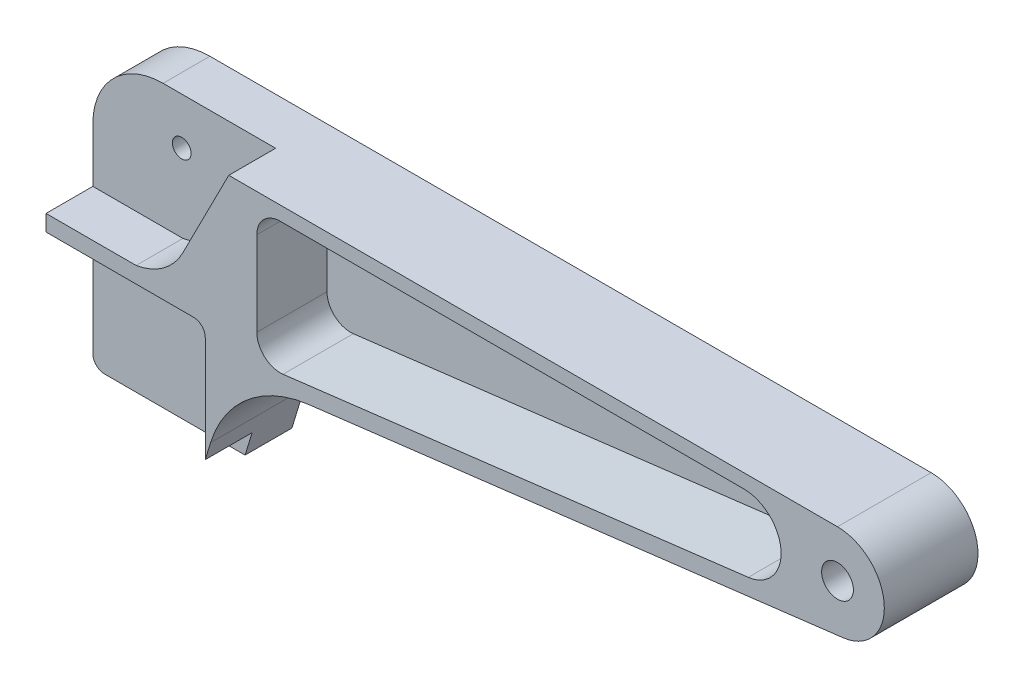
ISO-10303-21;
HEADER;
FILE_DESCRIPTION(('STEP AP214'),'2;1');
FILE_NAME('part.step','',(''),(''),'','','');
FILE_SCHEMA(('AUTOMOTIVE_DESIGN { 1 0 10303 214 1 1 1 1 }'));
ENDSEC;
DATA;
#1=APPLICATION_CONTEXT('core data for automotive mechanical design processes');
#2=APPLICATION_PROTOCOL_DEFINITION('international standard','automotive_design',2000,#1);
#3=PRODUCT_CONTEXT('',#1,'mechanical');
#4=PRODUCT('Part','Part','',(#3));
#5=PRODUCT_RELATED_PRODUCT_CATEGORY('part','',(#4));
#6=PRODUCT_DEFINITION_FORMATION('','',#4);
#7=PRODUCT_DEFINITION_CONTEXT('part definition',#1,'design');
#8=PRODUCT_DEFINITION('design','',#6,#7);
#9=PRODUCT_DEFINITION_SHAPE('','',#8);
#10=(LENGTH_UNIT() NAMED_UNIT(*) SI_UNIT(.MILLI.,.METRE.));
#11=(NAMED_UNIT(*) PLANE_ANGLE_UNIT() SI_UNIT($,.RADIAN.));
#12=(NAMED_UNIT(*) SI_UNIT($,.STERADIAN.) SOLID_ANGLE_UNIT());
#13=UNCERTAINTY_MEASURE_WITH_UNIT(LENGTH_MEASURE(1.E-05),#10,'distance_accuracy_value','');
#14=(GEOMETRIC_REPRESENTATION_CONTEXT(3) GLOBAL_UNCERTAINTY_ASSIGNED_CONTEXT((#13)) GLOBAL_UNIT_ASSIGNED_CONTEXT((#10,
#11,#12)) REPRESENTATION_CONTEXT('',''));
#15=CARTESIAN_POINT('',(0.,0.,0.));
#16=DIRECTION('',(0.,0.,1.));
#17=DIRECTION('',(1.,0.,0.));
#18=AXIS2_PLACEMENT_3D('',#15,#16,#17);
#19=CARTESIAN_POINT('',(337.954981469636,-20.,40.));
#20=DIRECTION('',(0.,0.,-1.));
#21=DIRECTION('',(-1.,0.,0.));
#22=AXIS2_PLACEMENT_3D('',#19,#20,#21);
#23=PLANE('',#22);
#24=DIRECTION('',(-1.,0.,0.));
#25=VECTOR('',#24,1.);
#26=CARTESIAN_POINT('',(100.,-6.,40.));
#27=LINE('',#26,#25);
#28=CARTESIAN_POINT('',(297.954981469636,-6.,40.));
#29=VERTEX_POINT('',#28);
#30=CARTESIAN_POINT('',(100.,-6.,40.));
#31=VERTEX_POINT('',#30);
#32=EDGE_CURVE('E264',#29,#31,#27,.T.);
#33=ORIENTED_EDGE('',*,*,#32,.F.);
#34=CARTESIAN_POINT('',(297.954981469636,-21.9275567058331,40.));
#35=DIRECTION('',(0.,0.,1.));
#36=DIRECTION('',(-1.,0.,0.));
#37=AXIS2_PLACEMENT_3D('',#34,#35,#36);
#38=CIRCLE('',#37,15.9275567058331);
#39=CARTESIAN_POINT('',(299.884912283814,-37.7377568838833,40.));
#40=VERTEX_POINT('',#39);
#41=EDGE_CURVE('E242',#40,#29,#38,.T.);
#42=ORIENTED_EDGE('',*,*,#41,.F.);
#43=DIRECTION('',(0.992631856225636,0.121169294815343,0.));
#44=VECTOR('',#43,1.);
#45=CARTESIAN_POINT('',(299.884912283814,-37.7377568838833,40.));
#46=LINE('',#45,#44);
#47=CARTESIAN_POINT('',(101.211692948153,-61.9895414046129,40.));
#48=VERTEX_POINT('',#47);
#49=EDGE_CURVE('E247',#48,#40,#46,.T.);
#50=ORIENTED_EDGE('',*,*,#49,.F.);
#51=CARTESIAN_POINT('',(100.,-52.0632228423565,40.));
#52=DIRECTION('',(0.,0.,1.));
#53=DIRECTION('',(-1.,0.,0.));
#54=AXIS2_PLACEMENT_3D('',#51,#52,#53);
#55=CIRCLE('',#54,9.99999999999999);
#56=CARTESIAN_POINT('',(90.,-52.0632228423565,40.));
#57=VERTEX_POINT('',#56);
#58=EDGE_CURVE('E273',#57,#48,#55,.T.);
#59=ORIENTED_EDGE('',*,*,#58,.F.);
#60=DIRECTION('',(0.,-1.,0.));
#61=VECTOR('',#60,1.);
#62=CARTESIAN_POINT('',(90.,-52.0632228423565,40.));
#63=LINE('',#62,#61);
#64=CARTESIAN_POINT('',(90.,-16.0000000000001,40.));
#65=VERTEX_POINT('',#64);
#66=EDGE_CURVE('E270',#65,#57,#63,.T.);
#67=ORIENTED_EDGE('',*,*,#66,.F.);
#68=CARTESIAN_POINT('',(100.,-16.,40.));
#69=DIRECTION('',(0.,0.,1.));
#70=DIRECTION('',(-1.,0.,0.));
#71=AXIS2_PLACEMENT_3D('',#68,#69,#70);
#72=CIRCLE('',#71,10.);
#73=EDGE_CURVE('E267',#31,#65,#72,.T.);
#74=ORIENTED_EDGE('',*,*,#73,.F.);
#75=EDGE_LOOP('',(#33,#42,#50,#59,#67,#74));
#76=FACE_BOUND('',#75,.T.);
#77=DIRECTION('',(-1.,0.,0.));
#78=VECTOR('',#77,1.);
#79=CARTESIAN_POINT('',(0.,0.,40.));
#80=LINE('',#79,#78);
#81=CARTESIAN_POINT('',(337.954981469636,0.,40.));
#82=VERTEX_POINT('',#81);
#83=CARTESIAN_POINT('',(78.036982515642,0.,40.));
#84=VERTEX_POINT('',#83);
#85=EDGE_CURVE('E308',#82,#84,#80,.T.);
#86=ORIENTED_EDGE('',*,*,#85,.T.);
#87=DIRECTION('',(0.454463972113324,0.890765119462465,0.));
#88=VECTOR('',#87,1.);
#89=CARTESIAN_POINT('',(78.036982515642,0.,40.));
#90=LINE('',#89,#88);
#91=CARTESIAN_POINT('',(58.355302576435,-38.5767740856212,40.));
#92=VERTEX_POINT('',#91);
#93=EDGE_CURVE('E433',#92,#84,#90,.T.);
#94=ORIENTED_EDGE('',*,*,#93,.F.);
#95=CARTESIAN_POINT('',(34.021805435185,-26.1619438182505,40.));
#96=DIRECTION('',(0.,0.,1.));
#97=DIRECTION('',(-1.,0.,0.));
#98=AXIS2_PLACEMENT_3D('',#95,#96,#97);
#99=CIRCLE('',#98,27.3175235643871);
#100=CARTESIAN_POINT('',(38.4763483427987,-53.1138294883678,40.));
#101=VERTEX_POINT('',#100);
#102=EDGE_CURVE('E431',#101,#92,#99,.T.);
#103=ORIENTED_EDGE('',*,*,#102,.F.);
#104=DIRECTION('',(1.,0.,0.));
#105=VECTOR('',#104,1.);
#106=CARTESIAN_POINT('',(38.4763483427987,-53.1138294883678,40.));
#107=LINE('',#106,#105);
#108=CARTESIAN_POINT('',(0.,-53.1138294883678,40.));
#109=VERTEX_POINT('',#108);
#110=EDGE_CURVE('E428',#109,#101,#107,.T.);
#111=ORIENTED_EDGE('',*,*,#110,.F.);
#112=DIRECTION('',(0.,-1.,0.));
#113=VECTOR('',#112,1.);
#114=CARTESIAN_POINT('',(0.,-120.,40.));
#115=LINE('',#114,#113);
#116=CARTESIAN_POINT('',(0.,-60.,40.));
#117=VERTEX_POINT('',#116);
#118=EDGE_CURVE('E213',#109,#117,#115,.T.);
#119=ORIENTED_EDGE('',*,*,#118,.T.);
#120=DIRECTION('',(-1.,0.,0.));
#121=VECTOR('',#120,1.);
#122=CARTESIAN_POINT('',(0.,-60.,40.));
#123=LINE('',#122,#121);
#124=CARTESIAN_POINT('',(63.,-60.,40.));
#125=VERTEX_POINT('',#124);
#126=EDGE_CURVE('E229',#125,#117,#123,.T.);
#127=ORIENTED_EDGE('',*,*,#126,.F.);
#128=CARTESIAN_POINT('',(63.,-65.,40.));
#129=DIRECTION('',(0.,0.,-1.));
#130=DIRECTION('',(-1.,0.,0.));
#131=AXIS2_PLACEMENT_3D('',#128,#129,#130);
#132=CIRCLE('',#131,5.);
#133=CARTESIAN_POINT('',(68.,-65.,40.));
#134=VERTEX_POINT('',#133);
#135=EDGE_CURVE('E362',#125,#134,#132,.T.);
#136=ORIENTED_EDGE('',*,*,#135,.T.);
#137=DIRECTION('',(0.,1.,0.));
#138=VECTOR('',#137,1.);
#139=CARTESIAN_POINT('',(68.,-60.,40.));
#140=LINE('',#139,#138);
#141=CARTESIAN_POINT('',(68.,-110.189189189189,40.));
#142=VERTEX_POINT('',#141);
#143=EDGE_CURVE('E224',#142,#134,#140,.T.);
#144=ORIENTED_EDGE('',*,*,#143,.F.);
#145=DIRECTION('',(0.292419316802901,0.95629019819327,0.));
#146=VECTOR('',#145,1.);
#147=CARTESIAN_POINT('',(79.7824664671216,-71.6573393913052,40.));
#148=LINE('',#147,#146);
#149=CARTESIAN_POINT('',(70.2806859489938,-102.730729734372,40.));
#150=VERTEX_POINT('',#149);
#151=EDGE_CURVE('E301',#142,#150,#148,.T.);
#152=ORIENTED_EDGE('',*,*,#151,.T.);
#153=CARTESIAN_POINT('',(118.095195858657,-117.351695574517,40.));
#154=DIRECTION('',(0.,0.,-1.));
#155=DIRECTION('',(-1.,0.,0.));
#156=AXIS2_PLACEMENT_3D('',#153,#154,#155);
#157=CIRCLE('',#156,50.);
#158=CARTESIAN_POINT('',(112.03673111789,-67.7201027632348,40.));
#159=VERTEX_POINT('',#158);
#160=EDGE_CURVE('E340',#150,#159,#157,.T.);
#161=ORIENTED_EDGE('',*,*,#160,.T.);
#162=DIRECTION('',(0.992631856225636,0.121169294815343,0.));
#163=VECTOR('',#162,1.);
#164=CARTESIAN_POINT('',(339.897074222548,-39.9054835595393,40.));
#165=LINE('',#164,#163);
#166=CARTESIAN_POINT('',(339.897074222548,-39.9054835595393,40.));
#167=VERTEX_POINT('',#166);
#168=EDGE_CURVE('E304',#159,#167,#165,.T.);
#169=ORIENTED_EDGE('',*,*,#168,.T.);
#170=CARTESIAN_POINT('',(337.954981469636,-20.,40.));
#171=DIRECTION('',(0.,0.,1.));
#172=DIRECTION('',(-1.,0.,0.));
#173=AXIS2_PLACEMENT_3D('',#170,#171,#172);
#174=CIRCLE('',#173,20.);
#175=EDGE_CURVE('E306',#167,#82,#174,.T.);
#176=ORIENTED_EDGE('',*,*,#175,.T.);
#177=EDGE_LOOP('',(#86,#94,#103,#111,#119,#127,#136,#144,#152,#161,#169,#176));
#178=FACE_BOUND('',#177,.T.);
#179=CARTESIAN_POINT('',(337.954981469636,-20.,40.));
#180=DIRECTION('',(0.,0.,1.));
#181=DIRECTION('',(1.,0.,0.));
#182=AXIS2_PLACEMENT_3D('',#179,#180,#181);
#183=CIRCLE('',#182,6.79194405246121);
#184=CARTESIAN_POINT('',(344.746925522098,-20.,40.));
#185=VERTEX_POINT('',#184);
#186=EDGE_CURVE('E291',#185,#185,#183,.T.);
#187=ORIENTED_EDGE('',*,*,#186,.F.);
#188=EDGE_LOOP('',(#187));
#189=FACE_BOUND('',#188,.T.);
#190=ADVANCED_FACE('F37',(#76,#178,#189),#23,.F.);
#191=CARTESIAN_POINT('',(337.954981469636,-20.,0.));
#192=DIRECTION('',(0.,0.,-1.));
#193=DIRECTION('',(-1.,0.,0.));
#194=AXIS2_PLACEMENT_3D('',#191,#192,#193);
#195=PLANE('',#194);
#196=CARTESIAN_POINT('',(37.9549814696364,-20.,0.));
#197=DIRECTION('',(0.,0.,1.));
#198=DIRECTION('',(1.,0.,0.));
#199=AXIS2_PLACEMENT_3D('',#196,#197,#198);
#200=CIRCLE('',#199,3.99526120733013);
#201=CARTESIAN_POINT('',(41.9502426769665,-20.,0.));
#202=VERTEX_POINT('',#201);
#203=EDGE_CURVE('E294',#202,#202,#200,.T.);
#204=ORIENTED_EDGE('',*,*,#203,.T.);
#205=EDGE_LOOP('',(#204));
#206=FACE_BOUND('',#205,.T.);
#207=DIRECTION('',(1.,0.,0.));
#208=VECTOR('',#207,1.);
#209=CARTESIAN_POINT('',(65.,-120.,0.));
#210=LINE('',#209,#208);
#211=CARTESIAN_POINT('',(5.,-120.,0.));
#212=VERTEX_POINT('',#211);
#213=CARTESIAN_POINT('',(65.,-120.,0.));
#214=VERTEX_POINT('',#213);
#215=EDGE_CURVE('E313',#212,#214,#210,.T.);
#216=ORIENTED_EDGE('',*,*,#215,.F.);
#217=CARTESIAN_POINT('',(5.,-115.,0.));
#218=DIRECTION('',(0.,0.,-1.));
#219=DIRECTION('',(-1.,0.,0.));
#220=AXIS2_PLACEMENT_3D('',#217,#218,#219);
#221=CIRCLE('',#220,5.);
#222=CARTESIAN_POINT('',(0.,-115.,0.));
#223=VERTEX_POINT('',#222);
#224=EDGE_CURVE('E367',#212,#223,#221,.T.);
#225=ORIENTED_EDGE('',*,*,#224,.T.);
#226=DIRECTION('',(0.,-1.,0.));
#227=VECTOR('',#226,1.);
#228=CARTESIAN_POINT('',(0.,-120.,0.));
#229=LINE('',#228,#227);
#230=CARTESIAN_POINT('',(0.,-30.,0.));
#231=VERTEX_POINT('',#230);
#232=EDGE_CURVE('E299',#231,#223,#229,.T.);
#233=ORIENTED_EDGE('',*,*,#232,.F.);
#234=CARTESIAN_POINT('',(30.,-30.,0.));
#235=DIRECTION('',(0.,0.,-1.));
#236=DIRECTION('',(-1.,0.,0.));
#237=AXIS2_PLACEMENT_3D('',#234,#235,#236);
#238=CIRCLE('',#237,30.);
#239=CARTESIAN_POINT('',(30.,0.,0.));
#240=VERTEX_POINT('',#239);
#241=EDGE_CURVE('E350',#231,#240,#238,.T.);
#242=ORIENTED_EDGE('',*,*,#241,.T.);
#243=DIRECTION('',(-1.,0.,0.));
#244=VECTOR('',#243,1.);
#245=CARTESIAN_POINT('',(0.,0.,0.));
#246=LINE('',#245,#244);
#247=CARTESIAN_POINT('',(337.954981469636,0.,0.));
#248=VERTEX_POINT('',#247);
#249=EDGE_CURVE('E302',#248,#240,#246,.T.);
#250=ORIENTED_EDGE('',*,*,#249,.F.);
#251=CARTESIAN_POINT('',(337.954981469636,-20.,0.));
#252=DIRECTION('',(0.,0.,1.));
#253=DIRECTION('',(-1.,0.,0.));
#254=AXIS2_PLACEMENT_3D('',#251,#252,#253);
#255=CIRCLE('',#254,20.);
#256=CARTESIAN_POINT('',(339.897074222548,-39.9054835595393,0.));
#257=VERTEX_POINT('',#256);
#258=EDGE_CURVE('E320',#257,#248,#255,.T.);
#259=ORIENTED_EDGE('',*,*,#258,.F.);
#260=DIRECTION('',(0.992631856225636,0.121169294815343,0.));
#261=VECTOR('',#260,1.);
#262=CARTESIAN_POINT('',(339.897074222548,-39.9054835595393,0.));
#263=LINE('',#262,#261);
#264=CARTESIAN_POINT('',(112.03673111789,-67.7201027632348,0.));
#265=VERTEX_POINT('',#264);
#266=EDGE_CURVE('E318',#265,#257,#263,.T.);
#267=ORIENTED_EDGE('',*,*,#266,.F.);
#268=CARTESIAN_POINT('',(118.095195858657,-117.351695574517,0.));
#269=DIRECTION('',(0.,0.,-1.));
#270=DIRECTION('',(-1.,0.,0.));
#271=AXIS2_PLACEMENT_3D('',#268,#269,#270);
#272=CIRCLE('',#271,50.);
#273=CARTESIAN_POINT('',(70.2806859489938,-102.730729734372,0.));
#274=VERTEX_POINT('',#273);
#275=EDGE_CURVE('E338',#265,#274,#272,.F.);
#276=ORIENTED_EDGE('',*,*,#275,.T.);
#277=DIRECTION('',(0.292419316802901,0.95629019819327,0.));
#278=VECTOR('',#277,1.);
#279=CARTESIAN_POINT('',(79.7824664671216,-71.6573393913052,0.));
#280=LINE('',#279,#278);
#281=EDGE_CURVE('E315',#214,#274,#280,.T.);
#282=ORIENTED_EDGE('',*,*,#281,.F.);
#283=EDGE_LOOP('',(#216,#225,#233,#242,#250,#259,#267,#276,#282));
#284=FACE_BOUND('',#283,.T.);
#285=CARTESIAN_POINT('',(337.954981469636,-20.,0.));
#286=DIRECTION('',(0.,0.,1.));
#287=DIRECTION('',(1.,0.,0.));
#288=AXIS2_PLACEMENT_3D('',#285,#286,#287);
#289=CIRCLE('',#288,6.79194405246121);
#290=CARTESIAN_POINT('',(344.746925522098,-20.,0.));
#291=VERTEX_POINT('',#290);
#292=EDGE_CURVE('E280',#291,#291,#289,.T.);
#293=ORIENTED_EDGE('',*,*,#292,.T.);
#294=EDGE_LOOP('',(#293));
#295=FACE_BOUND('',#294,.T.);
#296=ADVANCED_FACE('F381',(#206,#284,#295),#195,.T.);
#297=CARTESIAN_POINT('',(0.,-120.,40.));
#298=DIRECTION('',(1.,0.,0.));
#299=DIRECTION('',(0.,0.,-1.));
#300=AXIS2_PLACEMENT_3D('',#297,#298,#299);
#301=PLANE('',#300);
#302=ORIENTED_EDGE('',*,*,#118,.F.);
#303=DIRECTION('',(0.,0.,1.));
#304=VECTOR('',#303,1.);
#305=CARTESIAN_POINT('',(0.,-53.1138294883678,20.));
#306=LINE('',#305,#304);
#307=CARTESIAN_POINT('',(0.,-53.1138294883678,20.));
#308=VERTEX_POINT('',#307);
#309=EDGE_CURVE('E204',#308,#109,#306,.T.);
#310=ORIENTED_EDGE('',*,*,#309,.F.);
#311=DIRECTION('',(0.,-1.,0.));
#312=VECTOR('',#311,1.);
#313=CARTESIAN_POINT('',(0.,0.,20.));
#314=LINE('',#313,#312);
#315=CARTESIAN_POINT('',(0.,-30.,20.));
#316=VERTEX_POINT('',#315);
#317=EDGE_CURVE('E193',#316,#308,#314,.T.);
#318=ORIENTED_EDGE('',*,*,#317,.F.);
#319=DIRECTION('',(0.,0.,-1.));
#320=VECTOR('',#319,1.);
#321=CARTESIAN_POINT('',(0.,-30.,40.));
#322=LINE('',#321,#320);
#323=EDGE_CURVE('E348',#316,#231,#322,.T.);
#324=ORIENTED_EDGE('',*,*,#323,.T.);
#325=ORIENTED_EDGE('',*,*,#232,.T.);
#326=DIRECTION('',(0.,0.,-1.));
#327=VECTOR('',#326,1.);
#328=CARTESIAN_POINT('',(0.,-115.,40.));
#329=LINE('',#328,#327);
#330=CARTESIAN_POINT('',(0.,-115.,20.));
#331=VERTEX_POINT('',#330);
#332=EDGE_CURVE('E59',#223,#331,#329,.F.);
#333=ORIENTED_EDGE('',*,*,#332,.T.);
#334=DIRECTION('',(0.,-1.,0.));
#335=VECTOR('',#334,1.);
#336=CARTESIAN_POINT('',(0.,-120.,20.));
#337=LINE('',#336,#335);
#338=CARTESIAN_POINT('',(0.,-60.,20.));
#339=VERTEX_POINT('',#338);
#340=EDGE_CURVE('E226',#339,#331,#337,.T.);
#341=ORIENTED_EDGE('',*,*,#340,.F.);
#342=DIRECTION('',(0.,0.,1.));
#343=VECTOR('',#342,1.);
#344=CARTESIAN_POINT('',(0.,-60.,20.));
#345=LINE('',#344,#343);
#346=EDGE_CURVE('E236',#339,#117,#345,.T.);
#347=ORIENTED_EDGE('',*,*,#346,.T.);
#348=EDGE_LOOP('',(#302,#310,#318,#324,#325,#333,#341,#347));
#349=FACE_BOUND('',#348,.T.);
#350=ADVANCED_FACE('F211',(#349),#301,.F.);
#351=CARTESIAN_POINT('',(65.,-120.,40.));
#352=DIRECTION('',(0.,1.,0.));
#353=DIRECTION('',(0.,0.,1.));
#354=AXIS2_PLACEMENT_3D('',#351,#352,#353);
#355=PLANE('',#354);
#356=DIRECTION('',(1.,0.,0.));
#357=VECTOR('',#356,1.);
#358=CARTESIAN_POINT('',(68.,-120.,20.));
#359=LINE('',#358,#357);
#360=CARTESIAN_POINT('',(4.99999999999999,-120.,20.));
#361=VERTEX_POINT('',#360);
#362=CARTESIAN_POINT('',(65.,-120.,20.));
#363=VERTEX_POINT('',#362);
#364=EDGE_CURVE('E228',#361,#363,#359,.T.);
#365=ORIENTED_EDGE('',*,*,#364,.F.);
#366=DIRECTION('',(0.,0.,-1.));
#367=VECTOR('',#366,1.);
#368=CARTESIAN_POINT('',(5.,-120.,40.));
#369=LINE('',#368,#367);
#370=EDGE_CURVE('E364',#361,#212,#369,.T.);
#371=ORIENTED_EDGE('',*,*,#370,.T.);
#372=ORIENTED_EDGE('',*,*,#215,.T.);
#373=DIRECTION('',(0.,0.,-1.));
#374=VECTOR('',#373,1.);
#375=CARTESIAN_POINT('',(65.,-120.,40.));
#376=LINE('',#375,#374);
#377=EDGE_CURVE('E329',#363,#214,#376,.T.);
#378=ORIENTED_EDGE('',*,*,#377,.F.);
#379=EDGE_LOOP('',(#365,#371,#372,#378));
#380=FACE_BOUND('',#379,.T.);
#381=ADVANCED_FACE('F377',(#380),#355,.F.);
#382=CARTESIAN_POINT('',(79.7824664671216,-71.6573393913052,40.));
#383=DIRECTION('',(-0.956290198193271,0.292419316802901,0.));
#384=DIRECTION('',(-0.292419316802901,-0.956290198193271,0.));
#385=AXIS2_PLACEMENT_3D('',#382,#383,#384);
#386=PLANE('',#385);
#387=ORIENTED_EDGE('',*,*,#151,.F.);
#388=DIRECTION('',(0.,0.,-1.));
#389=VECTOR('',#388,1.);
#390=CARTESIAN_POINT('',(68.,-110.189189189189,40.));
#391=LINE('',#390,#389);
#392=CARTESIAN_POINT('',(68.,-110.189189189189,20.));
#393=VERTEX_POINT('',#392);
#394=EDGE_CURVE('E345',#142,#393,#391,.T.);
#395=ORIENTED_EDGE('',*,*,#394,.T.);
#396=DIRECTION('',(-0.292419316802901,-0.956290198193271,0.));
#397=VECTOR('',#396,1.);
#398=CARTESIAN_POINT('',(79.7824664671216,-71.6573393913052,20.));
#399=LINE('',#398,#397);
#400=EDGE_CURVE('E342',#393,#363,#399,.T.);
#401=ORIENTED_EDGE('',*,*,#400,.T.);
#402=ORIENTED_EDGE('',*,*,#377,.T.);
#403=ORIENTED_EDGE('',*,*,#281,.T.);
#404=DIRECTION('',(0.,0.,-1.));
#405=VECTOR('',#404,1.);
#406=CARTESIAN_POINT('',(70.2806859489938,-102.730729734372,40.));
#407=LINE('',#406,#405);
#408=EDGE_CURVE('E335',#274,#150,#407,.F.);
#409=ORIENTED_EDGE('',*,*,#408,.T.);
#410=EDGE_LOOP('',(#387,#395,#401,#402,#403,#409));
#411=FACE_BOUND('',#410,.T.);
#412=ADVANCED_FACE('F410',(#411),#386,.F.);
#413=CARTESIAN_POINT('',(339.897074222548,-39.9054835595393,40.));
#414=DIRECTION('',(-0.121169294815343,0.992631856225636,0.));
#415=DIRECTION('',(-0.992631856225636,-0.121169294815343,0.));
#416=AXIS2_PLACEMENT_3D('',#413,#414,#415);
#417=PLANE('',#416);
#418=ORIENTED_EDGE('',*,*,#168,.F.);
#419=DIRECTION('',(0.,0.,-1.));
#420=VECTOR('',#419,1.);
#421=CARTESIAN_POINT('',(112.03673111789,-67.7201027632348,0.));
#422=LINE('',#421,#420);
#423=EDGE_CURVE('E332',#159,#265,#422,.T.);
#424=ORIENTED_EDGE('',*,*,#423,.T.);
#425=ORIENTED_EDGE('',*,*,#266,.T.);
#426=DIRECTION('',(0.,0.,-1.));
#427=VECTOR('',#426,1.);
#428=CARTESIAN_POINT('',(339.897074222548,-39.9054835595393,40.));
#429=LINE('',#428,#427);
#430=EDGE_CURVE('E326',#167,#257,#429,.T.);
#431=ORIENTED_EDGE('',*,*,#430,.F.);
#432=EDGE_LOOP('',(#418,#424,#425,#431));
#433=FACE_BOUND('',#432,.T.);
#434=ADVANCED_FACE('F402',(#433),#417,.F.);
#435=CARTESIAN_POINT('',(337.954981469636,-20.,40.));
#436=DIRECTION('',(0.,0.,-1.));
#437=DIRECTION('',(-1.,0.,0.));
#438=AXIS2_PLACEMENT_3D('',#435,#436,#437);
#439=CYLINDRICAL_SURFACE('',#438,20.);
#440=ORIENTED_EDGE('',*,*,#258,.T.);
#441=DIRECTION('',(0.,0.,-1.));
#442=VECTOR('',#441,1.);
#443=CARTESIAN_POINT('',(337.954981469636,0.,40.));
#444=LINE('',#443,#442);
#445=EDGE_CURVE('E311',#82,#248,#444,.T.);
#446=ORIENTED_EDGE('',*,*,#445,.F.);
#447=ORIENTED_EDGE('',*,*,#175,.F.);
#448=ORIENTED_EDGE('',*,*,#430,.T.);
#449=EDGE_LOOP('',(#440,#446,#447,#448));
#450=FACE_BOUND('',#449,.T.);
#451=ADVANCED_FACE('F397',(#450),#439,.T.);
#452=CARTESIAN_POINT('',(0.,0.,40.));
#453=DIRECTION('',(0.,-1.,0.));
#454=DIRECTION('',(0.,0.,-1.));
#455=AXIS2_PLACEMENT_3D('',#452,#453,#454);
#456=PLANE('',#455);
#457=DIRECTION('',(-1.,0.,0.));
#458=VECTOR('',#457,1.);
#459=CARTESIAN_POINT('',(78.036982515642,0.,20.));
#460=LINE('',#459,#458);
#461=CARTESIAN_POINT('',(78.036982515642,0.,20.));
#462=VERTEX_POINT('',#461);
#463=CARTESIAN_POINT('',(30.,0.,20.));
#464=VERTEX_POINT('',#463);
#465=EDGE_CURVE('E51',#462,#464,#460,.T.);
#466=ORIENTED_EDGE('',*,*,#465,.F.);
#467=DIRECTION('',(0.,0.,1.));
#468=VECTOR('',#467,1.);
#469=CARTESIAN_POINT('',(78.036982515642,0.,20.));
#470=LINE('',#469,#468);
#471=EDGE_CURVE('E225',#462,#84,#470,.T.);
#472=ORIENTED_EDGE('',*,*,#471,.T.);
#473=ORIENTED_EDGE('',*,*,#85,.F.);
#474=ORIENTED_EDGE('',*,*,#445,.T.);
#475=ORIENTED_EDGE('',*,*,#249,.T.);
#476=DIRECTION('',(0.,0.,-1.));
#477=VECTOR('',#476,1.);
#478=CARTESIAN_POINT('',(30.,0.,40.));
#479=LINE('',#478,#477);
#480=EDGE_CURVE('E352',#240,#464,#479,.F.);
#481=ORIENTED_EDGE('',*,*,#480,.T.);
#482=EDGE_LOOP('',(#466,#472,#473,#474,#475,#481));
#483=FACE_BOUND('',#482,.T.);
#484=ADVANCED_FACE('F391',(#483),#456,.F.);
#485=CARTESIAN_POINT('',(37.9549814696364,-20.,40.));
#486=DIRECTION('',(0.,0.,-1.));
#487=DIRECTION('',(-1.,0.,0.));
#488=AXIS2_PLACEMENT_3D('',#485,#486,#487);
#489=CYLINDRICAL_SURFACE('',#488,3.99526120733013);
#490=CARTESIAN_POINT('',(37.9549814696364,-20.,20.));
#491=DIRECTION('',(0.,0.,-1.));
#492=DIRECTION('',(-1.,0.,0.));
#493=AXIS2_PLACEMENT_3D('',#490,#491,#492);
#494=CIRCLE('',#493,3.99526120733013);
#495=CARTESIAN_POINT('',(33.9597202623063,-20.,20.));
#496=VERTEX_POINT('',#495);
#497=EDGE_CURVE('E221',#496,#496,#494,.T.);
#498=ORIENTED_EDGE('',*,*,#497,.F.);
#499=EDGE_LOOP('',(#498));
#500=FACE_BOUND('',#499,.T.);
#501=ORIENTED_EDGE('',*,*,#203,.F.);
#502=EDGE_LOOP('',(#501));
#503=FACE_BOUND('',#502,.T.);
#504=ADVANCED_FACE('F464',(#500,#503),#489,.F.);
#505=CARTESIAN_POINT('',(337.954981469636,-20.,40.));
#506=DIRECTION('',(0.,0.,-1.));
#507=DIRECTION('',(-1.,0.,0.));
#508=AXIS2_PLACEMENT_3D('',#505,#506,#507);
#509=CYLINDRICAL_SURFACE('',#508,6.79194405246121);
#510=ORIENTED_EDGE('',*,*,#186,.T.);
#511=EDGE_LOOP('',(#510));
#512=FACE_BOUND('',#511,.T.);
#513=ORIENTED_EDGE('',*,*,#292,.F.);
#514=EDGE_LOOP('',(#513));
#515=FACE_BOUND('',#514,.T.);
#516=ADVANCED_FACE('F634',(#512,#515),#509,.F.);
#517=CARTESIAN_POINT('',(297.954981469636,-21.9275567058331,10.));
#518=DIRECTION('',(0.,0.,1.));
#519=DIRECTION('',(1.,0.,0.));
#520=AXIS2_PLACEMENT_3D('',#517,#518,#519);
#521=CYLINDRICAL_SURFACE('',#520,15.9275567058331);
#522=ORIENTED_EDGE('',*,*,#41,.T.);
#523=DIRECTION('',(0.,0.,1.));
#524=VECTOR('',#523,1.);
#525=CARTESIAN_POINT('',(297.954981469636,-6.,10.));
#526=LINE('',#525,#524);
#527=CARTESIAN_POINT('',(297.954981469636,-6.,10.));
#528=VERTEX_POINT('',#527);
#529=EDGE_CURVE('E262',#528,#29,#526,.T.);
#530=ORIENTED_EDGE('',*,*,#529,.F.);
#531=CARTESIAN_POINT('',(297.954981469636,-21.9275567058331,10.));
#532=DIRECTION('',(0.,0.,1.));
#533=DIRECTION('',(-1.,0.,0.));
#534=AXIS2_PLACEMENT_3D('',#531,#532,#533);
#535=CIRCLE('',#534,15.9275567058331);
#536=CARTESIAN_POINT('',(299.884912283814,-37.7377568838833,10.));
#537=VERTEX_POINT('',#536);
#538=EDGE_CURVE('E243',#537,#528,#535,.T.);
#539=ORIENTED_EDGE('',*,*,#538,.F.);
#540=DIRECTION('',(0.,0.,1.));
#541=VECTOR('',#540,1.);
#542=CARTESIAN_POINT('',(299.884912283814,-37.7377568838833,10.));
#543=LINE('',#542,#541);
#544=EDGE_CURVE('E278',#537,#40,#543,.T.);
#545=ORIENTED_EDGE('',*,*,#544,.T.);
#546=EDGE_LOOP('',(#522,#530,#539,#545));
#547=FACE_BOUND('',#546,.T.);
#548=ADVANCED_FACE('F624',(#547),#521,.F.);
#549=CARTESIAN_POINT('',(299.884912283814,-37.7377568838833,10.));
#550=DIRECTION('',(0.121169294815343,-0.992631856225636,0.));
#551=DIRECTION('',(0.992631856225637,0.121169294815343,0.));
#552=AXIS2_PLACEMENT_3D('',#549,#550,#551);
#553=PLANE('',#552);
#554=ORIENTED_EDGE('',*,*,#49,.T.);
#555=ORIENTED_EDGE('',*,*,#544,.F.);
#556=DIRECTION('',(0.992631856225636,0.121169294815343,0.));
#557=VECTOR('',#556,1.);
#558=CARTESIAN_POINT('',(299.884912283814,-37.7377568838833,10.));
#559=LINE('',#558,#557);
#560=CARTESIAN_POINT('',(101.211692948153,-61.9895414046129,10.));
#561=VERTEX_POINT('',#560);
#562=EDGE_CURVE('E259',#561,#537,#559,.T.);
#563=ORIENTED_EDGE('',*,*,#562,.F.);
#564=DIRECTION('',(0.,0.,1.));
#565=VECTOR('',#564,1.);
#566=CARTESIAN_POINT('',(101.211692948153,-61.9895414046129,10.));
#567=LINE('',#566,#565);
#568=EDGE_CURVE('E281',#561,#48,#567,.T.);
#569=ORIENTED_EDGE('',*,*,#568,.T.);
#570=EDGE_LOOP('',(#554,#555,#563,#569));
#571=FACE_BOUND('',#570,.T.);
#572=ADVANCED_FACE('F614',(#571),#553,.F.);
#573=CARTESIAN_POINT('',(100.,-52.0632228423565,10.));
#574=DIRECTION('',(0.,0.,1.));
#575=DIRECTION('',(1.,0.,0.));
#576=AXIS2_PLACEMENT_3D('',#573,#574,#575);
#577=CYLINDRICAL_SURFACE('',#576,9.99999999999999);
#578=ORIENTED_EDGE('',*,*,#58,.T.);
#579=ORIENTED_EDGE('',*,*,#568,.F.);
#580=CARTESIAN_POINT('',(100.,-52.0632228423565,10.));
#581=DIRECTION('',(0.,0.,1.));
#582=DIRECTION('',(-1.,0.,0.));
#583=AXIS2_PLACEMENT_3D('',#580,#581,#582);
#584=CIRCLE('',#583,9.99999999999999);
#585=CARTESIAN_POINT('',(90.,-52.0632228423565,10.));
#586=VERTEX_POINT('',#585);
#587=EDGE_CURVE('E256',#586,#561,#584,.T.);
#588=ORIENTED_EDGE('',*,*,#587,.F.);
#589=DIRECTION('',(0.,0.,1.));
#590=VECTOR('',#589,1.);
#591=CARTESIAN_POINT('',(90.,-52.0632228423565,10.));
#592=LINE('',#591,#590);
#593=EDGE_CURVE('E283',#586,#57,#592,.T.);
#594=ORIENTED_EDGE('',*,*,#593,.T.);
#595=EDGE_LOOP('',(#578,#579,#588,#594));
#596=FACE_BOUND('',#595,.T.);
#597=ADVANCED_FACE('F604',(#596),#577,.F.);
#598=CARTESIAN_POINT('',(90.,-52.0632228423565,10.));
#599=DIRECTION('',(-1.,0.,0.));
#600=DIRECTION('',(0.,0.,1.));
#601=AXIS2_PLACEMENT_3D('',#598,#599,#600);
#602=PLANE('',#601);
#603=ORIENTED_EDGE('',*,*,#66,.T.);
#604=ORIENTED_EDGE('',*,*,#593,.F.);
#605=DIRECTION('',(0.,-1.,0.));
#606=VECTOR('',#605,1.);
#607=CARTESIAN_POINT('',(90.,-52.0632228423565,10.));
#608=LINE('',#607,#606);
#609=CARTESIAN_POINT('',(90.,-16.0000000000001,10.));
#610=VERTEX_POINT('',#609);
#611=EDGE_CURVE('E253',#610,#586,#608,.T.);
#612=ORIENTED_EDGE('',*,*,#611,.F.);
#613=DIRECTION('',(0.,0.,1.));
#614=VECTOR('',#613,1.);
#615=CARTESIAN_POINT('',(90.,-16.0000000000001,10.));
#616=LINE('',#615,#614);
#617=EDGE_CURVE('E285',#610,#65,#616,.T.);
#618=ORIENTED_EDGE('',*,*,#617,.T.);
#619=EDGE_LOOP('',(#603,#604,#612,#618));
#620=FACE_BOUND('',#619,.T.);
#621=ADVANCED_FACE('F594',(#620),#602,.F.);
#622=CARTESIAN_POINT('',(100.,-16.,10.));
#623=DIRECTION('',(0.,0.,1.));
#624=DIRECTION('',(1.,0.,0.));
#625=AXIS2_PLACEMENT_3D('',#622,#623,#624);
#626=CYLINDRICAL_SURFACE('',#625,10.);
#627=ORIENTED_EDGE('',*,*,#73,.T.);
#628=ORIENTED_EDGE('',*,*,#617,.F.);
#629=CARTESIAN_POINT('',(100.,-16.,10.));
#630=DIRECTION('',(0.,0.,1.));
#631=DIRECTION('',(-1.,0.,0.));
#632=AXIS2_PLACEMENT_3D('',#629,#630,#631);
#633=CIRCLE('',#632,10.);
#634=CARTESIAN_POINT('',(100.,-6.,10.));
#635=VERTEX_POINT('',#634);
#636=EDGE_CURVE('E250',#635,#610,#633,.T.);
#637=ORIENTED_EDGE('',*,*,#636,.F.);
#638=DIRECTION('',(0.,0.,1.));
#639=VECTOR('',#638,1.);
#640=CARTESIAN_POINT('',(100.,-6.,10.));
#641=LINE('',#640,#639);
#642=EDGE_CURVE('E287',#635,#31,#641,.T.);
#643=ORIENTED_EDGE('',*,*,#642,.T.);
#644=EDGE_LOOP('',(#627,#628,#637,#643));
#645=FACE_BOUND('',#644,.T.);
#646=ADVANCED_FACE('F584',(#645),#626,.F.);
#647=CARTESIAN_POINT('',(100.,-6.,10.));
#648=DIRECTION('',(0.,1.,0.));
#649=DIRECTION('',(-1.,0.,0.));
#650=AXIS2_PLACEMENT_3D('',#647,#648,#649);
#651=PLANE('',#650);
#652=ORIENTED_EDGE('',*,*,#32,.T.);
#653=ORIENTED_EDGE('',*,*,#642,.F.);
#654=DIRECTION('',(-1.,0.,0.));
#655=VECTOR('',#654,1.);
#656=CARTESIAN_POINT('',(100.,-6.,10.));
#657=LINE('',#656,#655);
#658=EDGE_CURVE('E246',#528,#635,#657,.T.);
#659=ORIENTED_EDGE('',*,*,#658,.F.);
#660=ORIENTED_EDGE('',*,*,#529,.T.);
#661=EDGE_LOOP('',(#652,#653,#659,#660));
#662=FACE_BOUND('',#661,.T.);
#663=ADVANCED_FACE('F574',(#662),#651,.F.);
#664=CARTESIAN_POINT('',(297.954981469636,-21.9275567058331,10.));
#665=DIRECTION('',(0.,0.,-1.));
#666=DIRECTION('',(-1.,0.,0.));
#667=AXIS2_PLACEMENT_3D('',#664,#665,#666);
#668=PLANE('',#667);
#669=ORIENTED_EDGE('',*,*,#538,.T.);
#670=ORIENTED_EDGE('',*,*,#658,.T.);
#671=ORIENTED_EDGE('',*,*,#636,.T.);
#672=ORIENTED_EDGE('',*,*,#611,.T.);
#673=ORIENTED_EDGE('',*,*,#587,.T.);
#674=ORIENTED_EDGE('',*,*,#562,.T.);
#675=EDGE_LOOP('',(#669,#670,#671,#672,#673,#674));
#676=FACE_BOUND('',#675,.T.);
#677=ADVANCED_FACE('F480',(#676),#668,.F.);
#678=CARTESIAN_POINT('',(118.095195858657,-117.351695574517,40.));
#679=DIRECTION('',(0.,0.,1.));
#680=DIRECTION('',(1.,0.,0.));
#681=AXIS2_PLACEMENT_3D('',#678,#679,#680);
#682=CYLINDRICAL_SURFACE('',#681,50.);
#683=ORIENTED_EDGE('',*,*,#160,.F.);
#684=ORIENTED_EDGE('',*,*,#408,.F.);
#685=ORIENTED_EDGE('',*,*,#275,.F.);
#686=ORIENTED_EDGE('',*,*,#423,.F.);
#687=EDGE_LOOP('',(#683,#684,#685,#686));
#688=FACE_BOUND('',#687,.T.);
#689=ADVANCED_FACE('F406',(#688),#682,.F.);
#690=CARTESIAN_POINT('',(68.,-60.,20.));
#691=DIRECTION('',(1.,0.,0.));
#692=DIRECTION('',(0.,1.,0.));
#693=AXIS2_PLACEMENT_3D('',#690,#691,#692);
#694=PLANE('',#693);
#695=ORIENTED_EDGE('',*,*,#143,.T.);
#696=DIRECTION('',(0.,0.,1.));
#697=VECTOR('',#696,1.);
#698=CARTESIAN_POINT('',(68.,-65.,20.));
#699=LINE('',#698,#697);
#700=CARTESIAN_POINT('',(68.,-65.,20.));
#701=VERTEX_POINT('',#700);
#702=EDGE_CURVE('E358',#134,#701,#699,.F.);
#703=ORIENTED_EDGE('',*,*,#702,.T.);
#704=DIRECTION('',(0.,1.,0.));
#705=VECTOR('',#704,1.);
#706=CARTESIAN_POINT('',(68.,-60.,20.));
#707=LINE('',#706,#705);
#708=EDGE_CURVE('E231',#393,#701,#707,.T.);
#709=ORIENTED_EDGE('',*,*,#708,.F.);
#710=ORIENTED_EDGE('',*,*,#394,.F.);
#711=EDGE_LOOP('',(#695,#703,#709,#710));
#712=FACE_BOUND('',#711,.T.);
#713=ADVANCED_FACE('F414',(#712),#694,.F.);
#714=CARTESIAN_POINT('',(0.,0.,20.));
#715=DIRECTION('',(0.,0.,-1.));
#716=DIRECTION('',(-1.,0.,0.));
#717=AXIS2_PLACEMENT_3D('',#714,#715,#716);
#718=PLANE('',#717);
#719=ORIENTED_EDGE('',*,*,#340,.T.);
#720=CARTESIAN_POINT('',(5.,-115.,20.));
#721=DIRECTION('',(0.,0.,-1.));
#722=DIRECTION('',(-1.,0.,0.));
#723=AXIS2_PLACEMENT_3D('',#720,#721,#722);
#724=CIRCLE('',#723,5.);
#725=EDGE_CURVE('E45',#331,#361,#724,.F.);
#726=ORIENTED_EDGE('',*,*,#725,.T.);
#727=ORIENTED_EDGE('',*,*,#364,.T.);
#728=ORIENTED_EDGE('',*,*,#400,.F.);
#729=ORIENTED_EDGE('',*,*,#708,.T.);
#730=CARTESIAN_POINT('',(63.,-65.,20.));
#731=DIRECTION('',(0.,0.,-1.));
#732=DIRECTION('',(-1.,0.,0.));
#733=AXIS2_PLACEMENT_3D('',#730,#731,#732);
#734=CIRCLE('',#733,5.);
#735=CARTESIAN_POINT('',(63.,-60.,20.));
#736=VERTEX_POINT('',#735);
#737=EDGE_CURVE('E360',#701,#736,#734,.F.);
#738=ORIENTED_EDGE('',*,*,#737,.T.);
#739=DIRECTION('',(-1.,0.,0.));
#740=VECTOR('',#739,1.);
#741=CARTESIAN_POINT('',(0.,-60.,20.));
#742=LINE('',#741,#740);
#743=EDGE_CURVE('E234',#736,#339,#742,.T.);
#744=ORIENTED_EDGE('',*,*,#743,.T.);
#745=EDGE_LOOP('',(#719,#726,#727,#728,#729,#738,#744));
#746=FACE_BOUND('',#745,.T.);
#747=ADVANCED_FACE('F372',(#746),#718,.F.);
#748=CARTESIAN_POINT('',(0.,-60.,20.));
#749=DIRECTION('',(0.,1.,0.));
#750=DIRECTION('',(-1.,0.,0.));
#751=AXIS2_PLACEMENT_3D('',#748,#749,#750);
#752=PLANE('',#751);
#753=ORIENTED_EDGE('',*,*,#743,.F.);
#754=DIRECTION('',(0.,0.,1.));
#755=VECTOR('',#754,1.);
#756=CARTESIAN_POINT('',(63.,-60.,40.));
#757=LINE('',#756,#755);
#758=EDGE_CURVE('E355',#736,#125,#757,.T.);
#759=ORIENTED_EDGE('',*,*,#758,.T.);
#760=ORIENTED_EDGE('',*,*,#126,.T.);
#761=ORIENTED_EDGE('',*,*,#346,.F.);
#762=EDGE_LOOP('',(#753,#759,#760,#761));
#763=FACE_BOUND('',#762,.T.);
#764=ADVANCED_FACE('F423',(#763),#752,.F.);
#765=CARTESIAN_POINT('',(30.,-30.,40.));
#766=DIRECTION('',(0.,0.,-1.));
#767=DIRECTION('',(-1.,0.,0.));
#768=AXIS2_PLACEMENT_3D('',#765,#766,#767);
#769=CYLINDRICAL_SURFACE('',#768,30.);
#770=CARTESIAN_POINT('',(30.,-30.,20.));
#771=DIRECTION('',(0.,0.,-1.));
#772=DIRECTION('',(-1.,0.,0.));
#773=AXIS2_PLACEMENT_3D('',#770,#771,#772);
#774=CIRCLE('',#773,30.);
#775=EDGE_CURVE('E11',#464,#316,#774,.F.);
#776=ORIENTED_EDGE('',*,*,#775,.F.);
#777=ORIENTED_EDGE('',*,*,#480,.F.);
#778=ORIENTED_EDGE('',*,*,#241,.F.);
#779=ORIENTED_EDGE('',*,*,#323,.F.);
#780=EDGE_LOOP('',(#776,#777,#778,#779));
#781=FACE_BOUND('',#780,.T.);
#782=ADVANCED_FACE('F387',(#781),#769,.T.);
#783=CARTESIAN_POINT('',(63.,-65.,20.));
#784=DIRECTION('',(0.,0.,-1.));
#785=DIRECTION('',(-1.,0.,0.));
#786=AXIS2_PLACEMENT_3D('',#783,#784,#785);
#787=CYLINDRICAL_SURFACE('',#786,5.);
#788=ORIENTED_EDGE('',*,*,#737,.F.);
#789=ORIENTED_EDGE('',*,*,#702,.F.);
#790=ORIENTED_EDGE('',*,*,#135,.F.);
#791=ORIENTED_EDGE('',*,*,#758,.F.);
#792=EDGE_LOOP('',(#788,#789,#790,#791));
#793=FACE_BOUND('',#792,.T.);
#794=ADVANCED_FACE('F418',(#793),#787,.F.);
#795=CARTESIAN_POINT('',(5.,-115.,40.));
#796=DIRECTION('',(0.,0.,-1.));
#797=DIRECTION('',(-1.,0.,0.));
#798=AXIS2_PLACEMENT_3D('',#795,#796,#797);
#799=CYLINDRICAL_SURFACE('',#798,5.);
#800=ORIENTED_EDGE('',*,*,#725,.F.);
#801=ORIENTED_EDGE('',*,*,#332,.F.);
#802=ORIENTED_EDGE('',*,*,#224,.F.);
#803=ORIENTED_EDGE('',*,*,#370,.F.);
#804=EDGE_LOOP('',(#800,#801,#802,#803));
#805=FACE_BOUND('',#804,.T.);
#806=ADVANCED_FACE('F39',(#805),#799,.T.);
#807=CARTESIAN_POINT('',(78.036982515642,0.,20.));
#808=DIRECTION('',(0.890765119462465,-0.454463972113324,0.));
#809=DIRECTION('',(0.454463972113324,0.890765119462465,0.));
#810=AXIS2_PLACEMENT_3D('',#807,#808,#809);
#811=PLANE('',#810);
#812=ORIENTED_EDGE('',*,*,#93,.T.);
#813=ORIENTED_EDGE('',*,*,#471,.F.);
#814=DIRECTION('',(0.454463972113324,0.890765119462465,0.));
#815=VECTOR('',#814,1.);
#816=CARTESIAN_POINT('',(78.036982515642,0.,20.));
#817=LINE('',#816,#815);
#818=CARTESIAN_POINT('',(58.355302576435,-38.5767740856212,20.));
#819=VERTEX_POINT('',#818);
#820=EDGE_CURVE('E214',#819,#462,#817,.T.);
#821=ORIENTED_EDGE('',*,*,#820,.F.);
#822=DIRECTION('',(0.,0.,1.));
#823=VECTOR('',#822,1.);
#824=CARTESIAN_POINT('',(58.355302576435,-38.5767740856212,20.));
#825=LINE('',#824,#823);
#826=EDGE_CURVE('E216',#819,#92,#825,.T.);
#827=ORIENTED_EDGE('',*,*,#826,.T.);
#828=EDGE_LOOP('',(#812,#813,#821,#827));
#829=FACE_BOUND('',#828,.T.);
#830=ADVANCED_FACE('F440',(#829),#811,.F.);
#831=CARTESIAN_POINT('',(34.021805435185,-26.1619438182505,20.));
#832=DIRECTION('',(0.,0.,1.));
#833=DIRECTION('',(1.,0.,0.));
#834=AXIS2_PLACEMENT_3D('',#831,#832,#833);
#835=CYLINDRICAL_SURFACE('',#834,27.3175235643871);
#836=ORIENTED_EDGE('',*,*,#102,.T.);
#837=ORIENTED_EDGE('',*,*,#826,.F.);
#838=CARTESIAN_POINT('',(34.021805435185,-26.1619438182505,20.));
#839=DIRECTION('',(0.,0.,1.));
#840=DIRECTION('',(-1.,0.,0.));
#841=AXIS2_PLACEMENT_3D('',#838,#839,#840);
#842=CIRCLE('',#841,27.3175235643871);
#843=CARTESIAN_POINT('',(38.4763483427987,-53.1138294883678,20.));
#844=VERTEX_POINT('',#843);
#845=EDGE_CURVE('E208',#844,#819,#842,.T.);
#846=ORIENTED_EDGE('',*,*,#845,.F.);
#847=DIRECTION('',(0.,0.,1.));
#848=VECTOR('',#847,1.);
#849=CARTESIAN_POINT('',(38.4763483427987,-53.1138294883678,20.));
#850=LINE('',#849,#848);
#851=EDGE_CURVE('E206',#844,#101,#850,.T.);
#852=ORIENTED_EDGE('',*,*,#851,.T.);
#853=EDGE_LOOP('',(#836,#837,#846,#852));
#854=FACE_BOUND('',#853,.T.);
#855=ADVANCED_FACE('F442',(#854),#835,.F.);
#856=CARTESIAN_POINT('',(38.4763483427987,-53.1138294883678,20.));
#857=DIRECTION('',(0.,-1.,0.));
#858=DIRECTION('',(1.,0.,0.));
#859=AXIS2_PLACEMENT_3D('',#856,#857,#858);
#860=PLANE('',#859);
#861=ORIENTED_EDGE('',*,*,#110,.T.);
#862=ORIENTED_EDGE('',*,*,#851,.F.);
#863=DIRECTION('',(1.,0.,0.));
#864=VECTOR('',#863,1.);
#865=CARTESIAN_POINT('',(38.4763483427987,-53.1138294883678,20.));
#866=LINE('',#865,#864);
#867=EDGE_CURVE('E197',#308,#844,#866,.T.);
#868=ORIENTED_EDGE('',*,*,#867,.F.);
#869=ORIENTED_EDGE('',*,*,#309,.T.);
#870=EDGE_LOOP('',(#861,#862,#868,#869));
#871=FACE_BOUND('',#870,.T.);
#872=ADVANCED_FACE('F203',(#871),#860,.F.);
#873=CARTESIAN_POINT('',(34.021805435185,-26.1619438182505,20.));
#874=DIRECTION('',(0.,0.,-1.));
#875=DIRECTION('',(-1.,0.,0.));
#876=AXIS2_PLACEMENT_3D('',#873,#874,#875);
#877=PLANE('',#876);
#878=ORIENTED_EDGE('',*,*,#497,.T.);
#879=EDGE_LOOP('',(#878));
#880=FACE_BOUND('',#879,.T.);
#881=ORIENTED_EDGE('',*,*,#775,.T.);
#882=ORIENTED_EDGE('',*,*,#317,.T.);
#883=ORIENTED_EDGE('',*,*,#867,.T.);
#884=ORIENTED_EDGE('',*,*,#845,.T.);
#885=ORIENTED_EDGE('',*,*,#820,.T.);
#886=ORIENTED_EDGE('',*,*,#465,.T.);
#887=EDGE_LOOP('',(#881,#882,#883,#884,#885,#886));
#888=FACE_BOUND('',#887,.T.);
#889=ADVANCED_FACE('F195',(#880,#888),#877,.F.);
#890=CLOSED_SHELL('',(#190,#296,#350,#381,#412,#434,#451,#484,#504,#516,#548,#572,#597,#621,
#646,#663,#677,#689,#713,#747,#764,#782,#794,#806,#830,#855,#872,#889));
#891=MANIFOLD_SOLID_BREP('B2',#890);
#892=ADVANCED_BREP_SHAPE_REPRESENTATION('',(#18,#891),#14);
#893=SHAPE_DEFINITION_REPRESENTATION(#9,#892);
ENDSEC;
END-ISO-10303-21;
